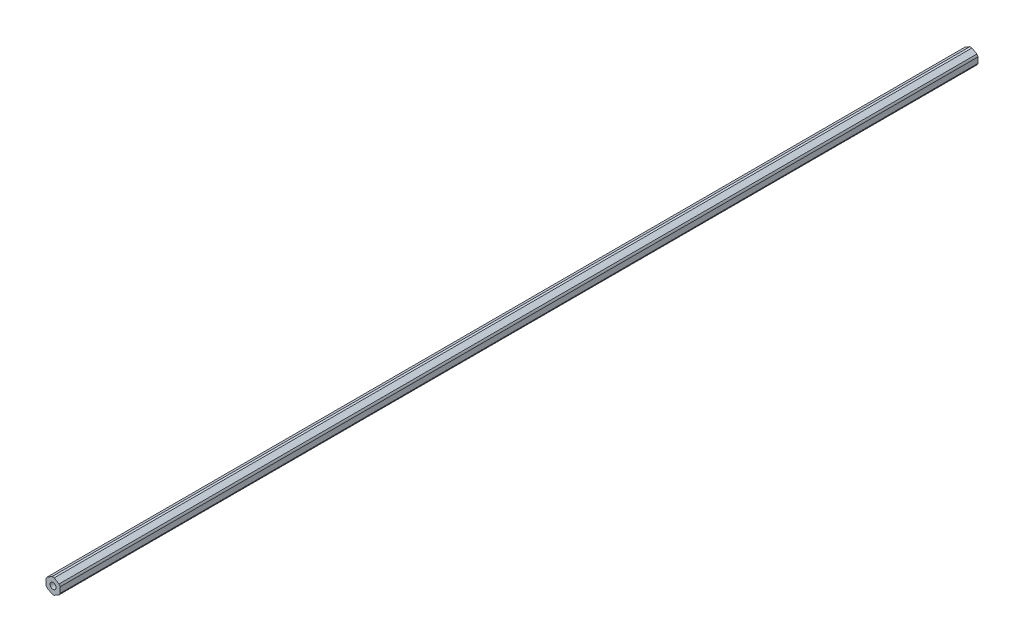
ISO-10303-21;
HEADER;
FILE_DESCRIPTION(('STEP AP214'),'2;1');
FILE_NAME('part.step','',(''),(''),'','','');
FILE_SCHEMA(('AUTOMOTIVE_DESIGN { 1 0 10303 214 1 1 1 1 }'));
ENDSEC;
DATA;
#1=APPLICATION_CONTEXT('core data for automotive mechanical design processes');
#2=APPLICATION_PROTOCOL_DEFINITION('international standard','automotive_design',2000,#1);
#3=PRODUCT_CONTEXT('',#1,'mechanical');
#4=PRODUCT('Part','Part','',(#3));
#5=PRODUCT_RELATED_PRODUCT_CATEGORY('part','',(#4));
#6=PRODUCT_DEFINITION_FORMATION('','',#4);
#7=PRODUCT_DEFINITION_CONTEXT('part definition',#1,'design');
#8=PRODUCT_DEFINITION('design','',#6,#7);
#9=PRODUCT_DEFINITION_SHAPE('','',#8);
#10=(LENGTH_UNIT() NAMED_UNIT(*) SI_UNIT(.MILLI.,.METRE.));
#11=(NAMED_UNIT(*) PLANE_ANGLE_UNIT() SI_UNIT($,.RADIAN.));
#12=(NAMED_UNIT(*) SI_UNIT($,.STERADIAN.) SOLID_ANGLE_UNIT());
#13=UNCERTAINTY_MEASURE_WITH_UNIT(LENGTH_MEASURE(1.E-05),#10,'distance_accuracy_value','');
#14=(GEOMETRIC_REPRESENTATION_CONTEXT(3) GLOBAL_UNCERTAINTY_ASSIGNED_CONTEXT((#13)) GLOBAL_UNIT_ASSIGNED_CONTEXT((#10,
#11,#12)) REPRESENTATION_CONTEXT('',''));
#15=CARTESIAN_POINT('',(0.,0.,0.));
#16=DIRECTION('',(0.,0.,1.));
#17=DIRECTION('',(1.,0.,0.));
#18=AXIS2_PLACEMENT_3D('',#15,#16,#17);
#19=CARTESIAN_POINT('',(4.7625,0.,307.975));
#20=DIRECTION('',(-1.,0.,0.));
#21=DIRECTION('',(0.,-1.,0.));
#22=AXIS2_PLACEMENT_3D('',#19,#20,#21);
#23=PLANE('',#22);
#24=DIRECTION('',(0.,1.,0.));
#25=VECTOR('',#24,1.);
#26=CARTESIAN_POINT('',(4.7625,0.,-307.975));
#27=LINE('',#26,#25);
#28=CARTESIAN_POINT('',(4.7625,-1.8932034040879,-307.975));
#29=VERTEX_POINT('',#28);
#30=CARTESIAN_POINT('',(4.7625,1.8932034040879,-307.975));
#31=VERTEX_POINT('',#30);
#32=EDGE_CURVE('E178',#29,#31,#27,.T.);
#33=ORIENTED_EDGE('',*,*,#32,.T.);
#34=DIRECTION('',(0.,0.,-1.));
#35=VECTOR('',#34,1.);
#36=CARTESIAN_POINT('',(4.7625,1.8932034040879,307.975));
#37=LINE('',#36,#35);
#38=CARTESIAN_POINT('',(4.7625,1.8932034040879,307.975));
#39=VERTEX_POINT('',#38);
#40=EDGE_CURVE('E11',#39,#31,#37,.T.);
#41=ORIENTED_EDGE('',*,*,#40,.F.);
#42=DIRECTION('',(0.,1.,0.));
#43=VECTOR('',#42,1.);
#44=CARTESIAN_POINT('',(4.7625,0.,307.975));
#45=LINE('',#44,#43);
#46=CARTESIAN_POINT('',(4.7625,-1.8932034040879,307.975));
#47=VERTEX_POINT('',#46);
#48=EDGE_CURVE('E237',#47,#39,#45,.T.);
#49=ORIENTED_EDGE('',*,*,#48,.F.);
#50=DIRECTION('',(0.,0.,-1.));
#51=VECTOR('',#50,1.);
#52=CARTESIAN_POINT('',(4.7625,-1.8932034040879,307.975));
#53=LINE('',#52,#51);
#54=EDGE_CURVE('E171',#47,#29,#53,.T.);
#55=ORIENTED_EDGE('',*,*,#54,.T.);
#56=EDGE_LOOP('',(#33,#41,#49,#55));
#57=FACE_BOUND('',#56,.T.);
#58=ADVANCED_FACE('F53',(#57),#23,.F.);
#59=CARTESIAN_POINT('',(0.,0.,307.975));
#60=DIRECTION('',(0.,0.,-1.));
#61=DIRECTION('',(-1.,0.,0.));
#62=AXIS2_PLACEMENT_3D('',#59,#60,#61);
#63=CYLINDRICAL_SURFACE('',#62,5.125000037);
#64=CARTESIAN_POINT('',(0.,0.,-307.975));
#65=DIRECTION('',(0.,0.,1.));
#66=DIRECTION('',(1.,0.,0.));
#67=AXIS2_PLACEMENT_3D('',#64,#65,#66);
#68=CIRCLE('',#67,5.125000037);
#69=CARTESIAN_POINT('',(4.02081224247129,3.17784428347944,-307.975));
#70=VERTEX_POINT('',#69);
#71=EDGE_CURVE('E181',#31,#70,#68,.T.);
#72=ORIENTED_EDGE('',*,*,#71,.T.);
#73=DIRECTION('',(0.,0.,-1.));
#74=VECTOR('',#73,1.);
#75=CARTESIAN_POINT('',(4.02081224247129,3.17784428347944,307.975));
#76=LINE('',#75,#74);
#77=CARTESIAN_POINT('',(4.02081224247129,3.17784428347944,307.975));
#78=VERTEX_POINT('',#77);
#79=EDGE_CURVE('E62',#78,#70,#76,.T.);
#80=ORIENTED_EDGE('',*,*,#79,.F.);
#81=CARTESIAN_POINT('',(0.,0.,307.975));
#82=DIRECTION('',(0.,0.,1.));
#83=DIRECTION('',(1.,0.,0.));
#84=AXIS2_PLACEMENT_3D('',#81,#82,#83);
#85=CIRCLE('',#84,5.125000037);
#86=EDGE_CURVE('E125',#39,#78,#85,.T.);
#87=ORIENTED_EDGE('',*,*,#86,.F.);
#88=ORIENTED_EDGE('',*,*,#40,.T.);
#89=EDGE_LOOP('',(#72,#80,#87,#88));
#90=FACE_BOUND('',#89,.T.);
#91=ADVANCED_FACE('F272',(#90),#63,.T.);
#92=CARTESIAN_POINT('',(2.38125,4.12444598552339,307.975));
#93=DIRECTION('',(-0.5,-0.866025403784439,0.));
#94=DIRECTION('',(0.866025403784439,-0.5,0.));
#95=AXIS2_PLACEMENT_3D('',#92,#93,#94);
#96=PLANE('',#95);
#97=DIRECTION('',(-0.866025403784439,0.5,0.));
#98=VECTOR('',#97,1.);
#99=CARTESIAN_POINT('',(2.38125,4.12444598552339,-307.975));
#100=LINE('',#99,#98);
#101=CARTESIAN_POINT('',(0.741687757528709,5.07104768756734,-307.975));
#102=VERTEX_POINT('',#101);
#103=EDGE_CURVE('E183',#70,#102,#100,.T.);
#104=ORIENTED_EDGE('',*,*,#103,.T.);
#105=DIRECTION('',(0.,0.,-1.));
#106=VECTOR('',#105,1.);
#107=CARTESIAN_POINT('',(0.741687757528709,5.07104768756734,307.975));
#108=LINE('',#107,#106);
#109=CARTESIAN_POINT('',(0.741687757528709,5.07104768756734,307.975));
#110=VERTEX_POINT('',#109);
#111=EDGE_CURVE('E213',#110,#102,#108,.T.);
#112=ORIENTED_EDGE('',*,*,#111,.F.);
#113=DIRECTION('',(-0.866025403784439,0.5,0.));
#114=VECTOR('',#113,1.);
#115=CARTESIAN_POINT('',(2.38125,4.12444598552339,307.975));
#116=LINE('',#115,#114);
#117=EDGE_CURVE('E221',#78,#110,#116,.T.);
#118=ORIENTED_EDGE('',*,*,#117,.F.);
#119=ORIENTED_EDGE('',*,*,#79,.T.);
#120=EDGE_LOOP('',(#104,#112,#118,#119));
#121=FACE_BOUND('',#120,.T.);
#122=ADVANCED_FACE('F219',(#121),#96,.F.);
#123=CARTESIAN_POINT('',(-0.741687757528708,5.07104768756734,-307.975));
#124=VERTEX_POINT('',#123);
#125=EDGE_CURVE('E184',#102,#124,#68,.T.);
#126=ORIENTED_EDGE('',*,*,#125,.T.);
#127=DIRECTION('',(0.,0.,-1.));
#128=VECTOR('',#127,1.);
#129=CARTESIAN_POINT('',(-0.741687757528708,5.07104768756734,307.975));
#130=LINE('',#129,#128);
#131=CARTESIAN_POINT('',(-0.741687757528708,5.07104768756734,307.975));
#132=VERTEX_POINT('',#131);
#133=EDGE_CURVE('E210',#132,#124,#130,.T.);
#134=ORIENTED_EDGE('',*,*,#133,.F.);
#135=EDGE_CURVE('E243',#110,#132,#85,.T.);
#136=ORIENTED_EDGE('',*,*,#135,.F.);
#137=ORIENTED_EDGE('',*,*,#111,.T.);
#138=EDGE_LOOP('',(#126,#134,#136,#137));
#139=FACE_BOUND('',#138,.T.);
#140=ADVANCED_FACE('F254',(#139),#63,.T.);
#141=CARTESIAN_POINT('',(-2.38125,4.12444598552339,307.975));
#142=DIRECTION('',(0.5,-0.866025403784439,0.));
#143=DIRECTION('',(0.866025403784439,0.5,0.));
#144=AXIS2_PLACEMENT_3D('',#141,#142,#143);
#145=PLANE('',#144);
#146=DIRECTION('',(-0.866025403784439,-0.5,0.));
#147=VECTOR('',#146,1.);
#148=CARTESIAN_POINT('',(-2.38125,4.12444598552339,-307.975));
#149=LINE('',#148,#147);
#150=CARTESIAN_POINT('',(-4.02081224247129,3.17784428347945,-307.975));
#151=VERTEX_POINT('',#150);
#152=EDGE_CURVE('E186',#124,#151,#149,.T.);
#153=ORIENTED_EDGE('',*,*,#152,.T.);
#154=DIRECTION('',(0.,0.,-1.));
#155=VECTOR('',#154,1.);
#156=CARTESIAN_POINT('',(-4.02081224247129,3.17784428347945,307.975));
#157=LINE('',#156,#155);
#158=CARTESIAN_POINT('',(-4.02081224247129,3.17784428347945,307.975));
#159=VERTEX_POINT('',#158);
#160=EDGE_CURVE('E207',#159,#151,#157,.T.);
#161=ORIENTED_EDGE('',*,*,#160,.F.);
#162=DIRECTION('',(-0.866025403784439,-0.5,0.));
#163=VECTOR('',#162,1.);
#164=CARTESIAN_POINT('',(-2.38125,4.12444598552339,307.975));
#165=LINE('',#164,#163);
#166=EDGE_CURVE('E245',#132,#159,#165,.T.);
#167=ORIENTED_EDGE('',*,*,#166,.F.);
#168=ORIENTED_EDGE('',*,*,#133,.T.);
#169=EDGE_LOOP('',(#153,#161,#167,#168));
#170=FACE_BOUND('',#169,.T.);
#171=ADVANCED_FACE('F256',(#170),#145,.F.);
#172=CARTESIAN_POINT('',(-4.7625,1.8932034040879,-307.975));
#173=VERTEX_POINT('',#172);
#174=EDGE_CURVE('E188',#151,#173,#68,.T.);
#175=ORIENTED_EDGE('',*,*,#174,.T.);
#176=DIRECTION('',(0.,0.,-1.));
#177=VECTOR('',#176,1.);
#178=CARTESIAN_POINT('',(-4.7625,1.8932034040879,307.975));
#179=LINE('',#178,#177);
#180=CARTESIAN_POINT('',(-4.7625,1.8932034040879,307.975));
#181=VERTEX_POINT('',#180);
#182=EDGE_CURVE('E204',#181,#173,#179,.T.);
#183=ORIENTED_EDGE('',*,*,#182,.F.);
#184=EDGE_CURVE('E246',#159,#181,#85,.T.);
#185=ORIENTED_EDGE('',*,*,#184,.F.);
#186=ORIENTED_EDGE('',*,*,#160,.T.);
#187=EDGE_LOOP('',(#175,#183,#185,#186));
#188=FACE_BOUND('',#187,.T.);
#189=ADVANCED_FACE('F257',(#188),#63,.T.);
#190=CARTESIAN_POINT('',(-4.7625,0.,307.975));
#191=DIRECTION('',(1.,0.,0.));
#192=DIRECTION('',(0.,0.,-1.));
#193=AXIS2_PLACEMENT_3D('',#190,#191,#192);
#194=PLANE('',#193);
#195=DIRECTION('',(0.,-1.,0.));
#196=VECTOR('',#195,1.);
#197=CARTESIAN_POINT('',(-4.7625,0.,-307.975));
#198=LINE('',#197,#196);
#199=CARTESIAN_POINT('',(-4.7625,-1.8932034040879,-307.975));
#200=VERTEX_POINT('',#199);
#201=EDGE_CURVE('E189',#173,#200,#198,.T.);
#202=ORIENTED_EDGE('',*,*,#201,.T.);
#203=DIRECTION('',(0.,0.,-1.));
#204=VECTOR('',#203,1.);
#205=CARTESIAN_POINT('',(-4.7625,-1.8932034040879,307.975));
#206=LINE('',#205,#204);
#207=CARTESIAN_POINT('',(-4.7625,-1.8932034040879,307.975));
#208=VERTEX_POINT('',#207);
#209=EDGE_CURVE('E201',#208,#200,#206,.T.);
#210=ORIENTED_EDGE('',*,*,#209,.F.);
#211=DIRECTION('',(0.,-1.,0.));
#212=VECTOR('',#211,1.);
#213=CARTESIAN_POINT('',(-4.7625,0.,307.975));
#214=LINE('',#213,#212);
#215=EDGE_CURVE('E247',#181,#208,#214,.T.);
#216=ORIENTED_EDGE('',*,*,#215,.F.);
#217=ORIENTED_EDGE('',*,*,#182,.T.);
#218=EDGE_LOOP('',(#202,#210,#216,#217));
#219=FACE_BOUND('',#218,.T.);
#220=ADVANCED_FACE('F260',(#219),#194,.F.);
#221=CARTESIAN_POINT('',(-4.02081224247129,-3.17784428347944,-307.975));
#222=VERTEX_POINT('',#221);
#223=EDGE_CURVE('E191',#200,#222,#68,.T.);
#224=ORIENTED_EDGE('',*,*,#223,.T.);
#225=DIRECTION('',(0.,0.,-1.));
#226=VECTOR('',#225,1.);
#227=CARTESIAN_POINT('',(-4.02081224247129,-3.17784428347944,307.975));
#228=LINE('',#227,#226);
#229=CARTESIAN_POINT('',(-4.02081224247129,-3.17784428347944,307.975));
#230=VERTEX_POINT('',#229);
#231=EDGE_CURVE('E198',#230,#222,#228,.T.);
#232=ORIENTED_EDGE('',*,*,#231,.F.);
#233=EDGE_CURVE('E161',#208,#230,#85,.T.);
#234=ORIENTED_EDGE('',*,*,#233,.F.);
#235=ORIENTED_EDGE('',*,*,#209,.T.);
#236=EDGE_LOOP('',(#224,#232,#234,#235));
#237=FACE_BOUND('',#236,.T.);
#238=ADVANCED_FACE('F262',(#237),#63,.T.);
#239=CARTESIAN_POINT('',(-2.38125,-4.12444598552339,307.975));
#240=DIRECTION('',(0.5,0.866025403784439,0.));
#241=DIRECTION('',(-0.866025403784438,0.5,0.));
#242=AXIS2_PLACEMENT_3D('',#239,#240,#241);
#243=PLANE('',#242);
#244=DIRECTION('',(0.866025403784439,-0.5,0.));
#245=VECTOR('',#244,1.);
#246=CARTESIAN_POINT('',(-2.38125,-4.12444598552339,-307.975));
#247=LINE('',#246,#245);
#248=CARTESIAN_POINT('',(-0.741687757528708,-5.07104768756734,-307.975));
#249=VERTEX_POINT('',#248);
#250=EDGE_CURVE('E192',#222,#249,#247,.T.);
#251=ORIENTED_EDGE('',*,*,#250,.T.);
#252=DIRECTION('',(0.,0.,-1.));
#253=VECTOR('',#252,1.);
#254=CARTESIAN_POINT('',(-0.741687757528708,-5.07104768756734,307.975));
#255=LINE('',#254,#253);
#256=CARTESIAN_POINT('',(-0.741687757528708,-5.07104768756734,307.975));
#257=VERTEX_POINT('',#256);
#258=EDGE_CURVE('E166',#257,#249,#255,.T.);
#259=ORIENTED_EDGE('',*,*,#258,.F.);
#260=DIRECTION('',(0.866025403784439,-0.5,0.));
#261=VECTOR('',#260,1.);
#262=CARTESIAN_POINT('',(-2.38125,-4.12444598552339,307.975));
#263=LINE('',#262,#261);
#264=EDGE_CURVE('E156',#230,#257,#263,.T.);
#265=ORIENTED_EDGE('',*,*,#264,.F.);
#266=ORIENTED_EDGE('',*,*,#231,.T.);
#267=EDGE_LOOP('',(#251,#259,#265,#266));
#268=FACE_BOUND('',#267,.T.);
#269=ADVANCED_FACE('F265',(#268),#243,.F.);
#270=CARTESIAN_POINT('',(0.741687757528704,-5.07104768756734,-307.975));
#271=VERTEX_POINT('',#270);
#272=EDGE_CURVE('E165',#249,#271,#68,.T.);
#273=ORIENTED_EDGE('',*,*,#272,.T.);
#274=DIRECTION('',(0.,0.,-1.));
#275=VECTOR('',#274,1.);
#276=CARTESIAN_POINT('',(0.741687757528704,-5.07104768756734,307.975));
#277=LINE('',#276,#275);
#278=CARTESIAN_POINT('',(0.741687757528704,-5.07104768756734,307.975));
#279=VERTEX_POINT('',#278);
#280=EDGE_CURVE('E162',#279,#271,#277,.T.);
#281=ORIENTED_EDGE('',*,*,#280,.F.);
#282=EDGE_CURVE('E150',#257,#279,#85,.T.);
#283=ORIENTED_EDGE('',*,*,#282,.F.);
#284=ORIENTED_EDGE('',*,*,#258,.T.);
#285=EDGE_LOOP('',(#273,#281,#283,#284));
#286=FACE_BOUND('',#285,.T.);
#287=ADVANCED_FACE('F163',(#286),#63,.T.);
#288=CARTESIAN_POINT('',(2.38125,-4.12444598552339,307.975));
#289=DIRECTION('',(-0.5,0.866025403784439,0.));
#290=DIRECTION('',(-0.866025403784439,-0.5,0.));
#291=AXIS2_PLACEMENT_3D('',#288,#289,#290);
#292=PLANE('',#291);
#293=DIRECTION('',(0.866025403784439,0.5,0.));
#294=VECTOR('',#293,1.);
#295=CARTESIAN_POINT('',(2.38125,-4.12444598552339,-307.975));
#296=LINE('',#295,#294);
#297=CARTESIAN_POINT('',(4.02081224247129,-3.17784428347944,-307.975));
#298=VERTEX_POINT('',#297);
#299=EDGE_CURVE('E111',#271,#298,#296,.T.);
#300=ORIENTED_EDGE('',*,*,#299,.T.);
#301=DIRECTION('',(0.,0.,-1.));
#302=VECTOR('',#301,1.);
#303=CARTESIAN_POINT('',(4.02081224247129,-3.17784428347944,307.975));
#304=LINE('',#303,#302);
#305=CARTESIAN_POINT('',(4.02081224247129,-3.17784428347944,307.975));
#306=VERTEX_POINT('',#305);
#307=EDGE_CURVE('E167',#306,#298,#304,.T.);
#308=ORIENTED_EDGE('',*,*,#307,.F.);
#309=DIRECTION('',(0.866025403784439,0.5,0.));
#310=VECTOR('',#309,1.);
#311=CARTESIAN_POINT('',(2.38125,-4.12444598552339,307.975));
#312=LINE('',#311,#310);
#313=EDGE_CURVE('E154',#279,#306,#312,.T.);
#314=ORIENTED_EDGE('',*,*,#313,.F.);
#315=ORIENTED_EDGE('',*,*,#280,.T.);
#316=EDGE_LOOP('',(#300,#308,#314,#315));
#317=FACE_BOUND('',#316,.T.);
#318=ADVANCED_FACE('F169',(#317),#292,.F.);
#319=CARTESIAN_POINT('',(0.,0.,307.975));
#320=DIRECTION('',(0.,0.,-1.));
#321=DIRECTION('',(-1.,0.,0.));
#322=AXIS2_PLACEMENT_3D('',#319,#320,#321);
#323=CYLINDRICAL_SURFACE('',#322,2.0193);
#324=CARTESIAN_POINT('',(0.,0.,307.975));
#325=DIRECTION('',(0.,0.,1.));
#326=DIRECTION('',(1.,0.,0.));
#327=AXIS2_PLACEMENT_3D('',#324,#325,#326);
#328=CIRCLE('',#327,2.0193);
#329=CARTESIAN_POINT('',(2.0193,0.,307.975));
#330=VERTEX_POINT('',#329);
#331=EDGE_CURVE('E235',#330,#330,#328,.T.);
#332=ORIENTED_EDGE('',*,*,#331,.T.);
#333=EDGE_LOOP('',(#332));
#334=FACE_BOUND('',#333,.T.);
#335=CARTESIAN_POINT('',(0.,0.,-307.975));
#336=DIRECTION('',(0.,0.,1.));
#337=DIRECTION('',(1.,0.,0.));
#338=AXIS2_PLACEMENT_3D('',#335,#336,#337);
#339=CIRCLE('',#338,2.0193);
#340=CARTESIAN_POINT('',(2.0193,0.,-307.975));
#341=VERTEX_POINT('',#340);
#342=EDGE_CURVE('E175',#341,#341,#339,.T.);
#343=ORIENTED_EDGE('',*,*,#342,.F.);
#344=EDGE_LOOP('',(#343));
#345=FACE_BOUND('',#344,.T.);
#346=ADVANCED_FACE('F55',(#334,#345),#323,.F.);
#347=EDGE_CURVE('E117',#298,#29,#68,.T.);
#348=ORIENTED_EDGE('',*,*,#347,.T.);
#349=ORIENTED_EDGE('',*,*,#54,.F.);
#350=EDGE_CURVE('E70',#306,#47,#85,.T.);
#351=ORIENTED_EDGE('',*,*,#350,.F.);
#352=ORIENTED_EDGE('',*,*,#307,.T.);
#353=EDGE_LOOP('',(#348,#349,#351,#352));
#354=FACE_BOUND('',#353,.T.);
#355=ADVANCED_FACE('F269',(#354),#63,.T.);
#356=CARTESIAN_POINT('',(0.,0.,307.975));
#357=DIRECTION('',(0.,0.,1.));
#358=DIRECTION('',(1.,0.,0.));
#359=AXIS2_PLACEMENT_3D('',#356,#357,#358);
#360=PLANE('',#359);
#361=ORIENTED_EDGE('',*,*,#331,.F.);
#362=EDGE_LOOP('',(#361));
#363=FACE_BOUND('',#362,.T.);
#364=ORIENTED_EDGE('',*,*,#48,.T.);
#365=ORIENTED_EDGE('',*,*,#86,.T.);
#366=ORIENTED_EDGE('',*,*,#117,.T.);
#367=ORIENTED_EDGE('',*,*,#135,.T.);
#368=ORIENTED_EDGE('',*,*,#166,.T.);
#369=ORIENTED_EDGE('',*,*,#184,.T.);
#370=ORIENTED_EDGE('',*,*,#215,.T.);
#371=ORIENTED_EDGE('',*,*,#233,.T.);
#372=ORIENTED_EDGE('',*,*,#264,.T.);
#373=ORIENTED_EDGE('',*,*,#282,.T.);
#374=ORIENTED_EDGE('',*,*,#313,.T.);
#375=ORIENTED_EDGE('',*,*,#350,.T.);
#376=EDGE_LOOP('',(#364,#365,#366,#367,#368,#369,#370,#371,#372,#373,#374,#375));
#377=FACE_BOUND('',#376,.T.);
#378=ADVANCED_FACE('F152',(#363,#377),#360,.T.);
#379=CARTESIAN_POINT('',(0.,0.,-307.975));
#380=DIRECTION('',(0.,0.,1.));
#381=DIRECTION('',(1.,0.,0.));
#382=AXIS2_PLACEMENT_3D('',#379,#380,#381);
#383=PLANE('',#382);
#384=ORIENTED_EDGE('',*,*,#342,.T.);
#385=EDGE_LOOP('',(#384));
#386=FACE_BOUND('',#385,.T.);
#387=ORIENTED_EDGE('',*,*,#32,.F.);
#388=ORIENTED_EDGE('',*,*,#347,.F.);
#389=ORIENTED_EDGE('',*,*,#299,.F.);
#390=ORIENTED_EDGE('',*,*,#272,.F.);
#391=ORIENTED_EDGE('',*,*,#250,.F.);
#392=ORIENTED_EDGE('',*,*,#223,.F.);
#393=ORIENTED_EDGE('',*,*,#201,.F.);
#394=ORIENTED_EDGE('',*,*,#174,.F.);
#395=ORIENTED_EDGE('',*,*,#152,.F.);
#396=ORIENTED_EDGE('',*,*,#125,.F.);
#397=ORIENTED_EDGE('',*,*,#103,.F.);
#398=ORIENTED_EDGE('',*,*,#71,.F.);
#399=EDGE_LOOP('',(#387,#388,#389,#390,#391,#392,#393,#394,#395,#396,#397,#398));
#400=FACE_BOUND('',#399,.T.);
#401=ADVANCED_FACE('F225',(#386,#400),#383,.F.);
#402=CLOSED_SHELL('',(#58,#91,#122,#140,#171,#189,#220,#238,#269,#287,#318,#346,#355,#378,#401));
#403=MANIFOLD_SOLID_BREP('B2',#402);
#404=ADVANCED_BREP_SHAPE_REPRESENTATION('',(#18,#403),#14);
#405=SHAPE_DEFINITION_REPRESENTATION(#9,#404);
ENDSEC;
END-ISO-10303-21;
